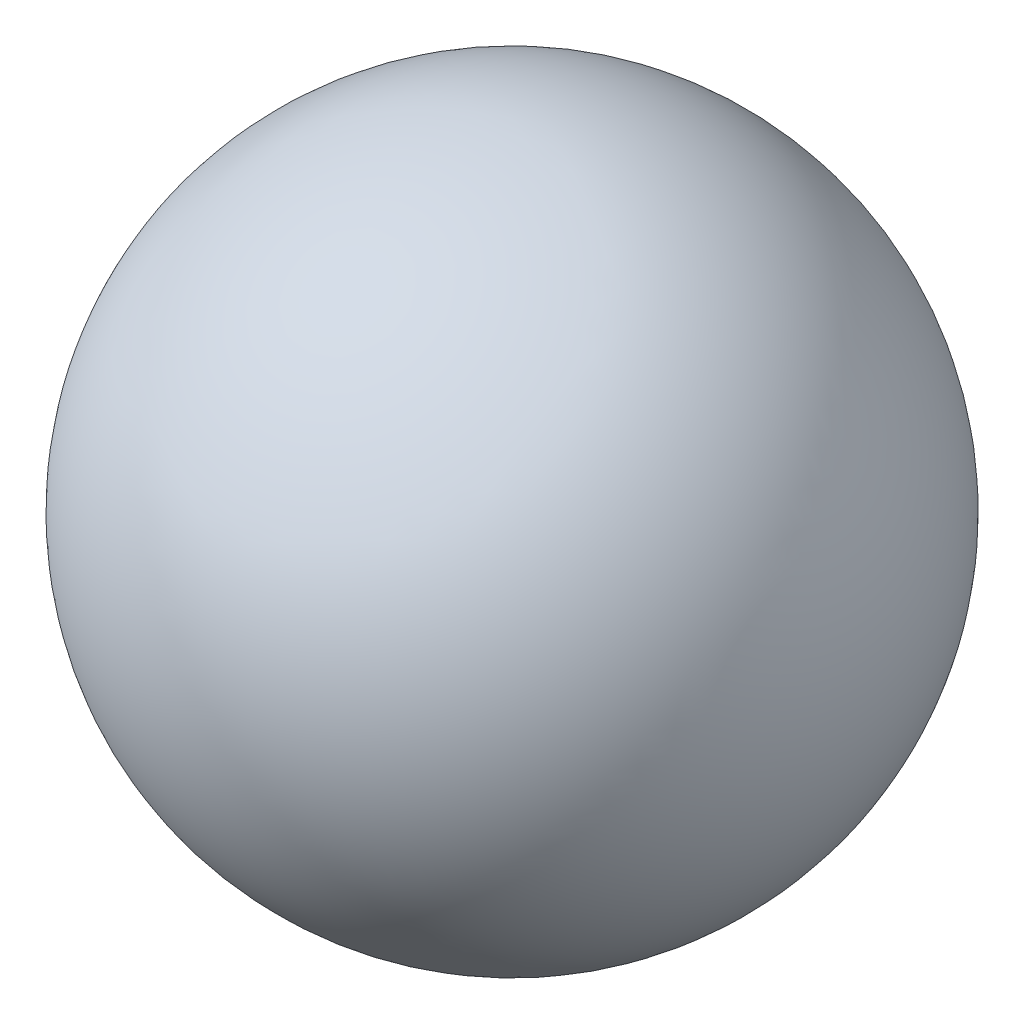
ISO-10303-21;
HEADER;
FILE_DESCRIPTION(('STEP AP214'),'2;1');
FILE_NAME('part.step','',(''),(''),'','','');
FILE_SCHEMA(('AUTOMOTIVE_DESIGN { 1 0 10303 214 1 1 1 1 }'));
ENDSEC;
DATA;
#1=APPLICATION_CONTEXT('core data for automotive mechanical design processes');
#2=APPLICATION_PROTOCOL_DEFINITION('international standard','automotive_design',2000,#1);
#3=PRODUCT_CONTEXT('',#1,'mechanical');
#4=PRODUCT('Part','Part','',(#3));
#5=PRODUCT_RELATED_PRODUCT_CATEGORY('part','',(#4));
#6=PRODUCT_DEFINITION_FORMATION('','',#4);
#7=PRODUCT_DEFINITION_CONTEXT('part definition',#1,'design');
#8=PRODUCT_DEFINITION('design','',#6,#7);
#9=PRODUCT_DEFINITION_SHAPE('','',#8);
#10=(LENGTH_UNIT() NAMED_UNIT(*) SI_UNIT(.MILLI.,.METRE.));
#11=(NAMED_UNIT(*) PLANE_ANGLE_UNIT() SI_UNIT($,.RADIAN.));
#12=(NAMED_UNIT(*) SI_UNIT($,.STERADIAN.) SOLID_ANGLE_UNIT());
#13=UNCERTAINTY_MEASURE_WITH_UNIT(LENGTH_MEASURE(1.E-05),#10,'distance_accuracy_value','');
#14=(GEOMETRIC_REPRESENTATION_CONTEXT(3) GLOBAL_UNCERTAINTY_ASSIGNED_CONTEXT((#13)) GLOBAL_UNIT_ASSIGNED_CONTEXT((#10,
#11,#12)) REPRESENTATION_CONTEXT('',''));
#15=CARTESIAN_POINT('',(0.,0.,0.));
#16=DIRECTION('',(0.,0.,1.));
#17=DIRECTION('',(1.,0.,0.));
#18=AXIS2_PLACEMENT_3D('',#15,#16,#17);
#19=CARTESIAN_POINT('',(0.,0.,0.));
#20=DIRECTION('',(-1.,0.,0.));
#21=DIRECTION('',(0.,0.,1.));
#22=AXIS2_PLACEMENT_3D('',#19,#20,#21);
#23=SPHERICAL_SURFACE('',#22,11.);
#24=CARTESIAN_POINT('',(-11.,0.,0.));
#25=VERTEX_POINT('',#24);
#26=VERTEX_LOOP('',#25);
#27=FACE_BOUND('',#26,.T.);
#28=ADVANCED_FACE('F31',(#27),#23,.T.);
#29=CLOSED_SHELL('',(#28));
#30=MANIFOLD_SOLID_BREP('B2',#29);
#31=ADVANCED_BREP_SHAPE_REPRESENTATION('',(#18,#30),#14);
#32=SHAPE_DEFINITION_REPRESENTATION(#9,#31);
ENDSEC;
END-ISO-10303-21;
